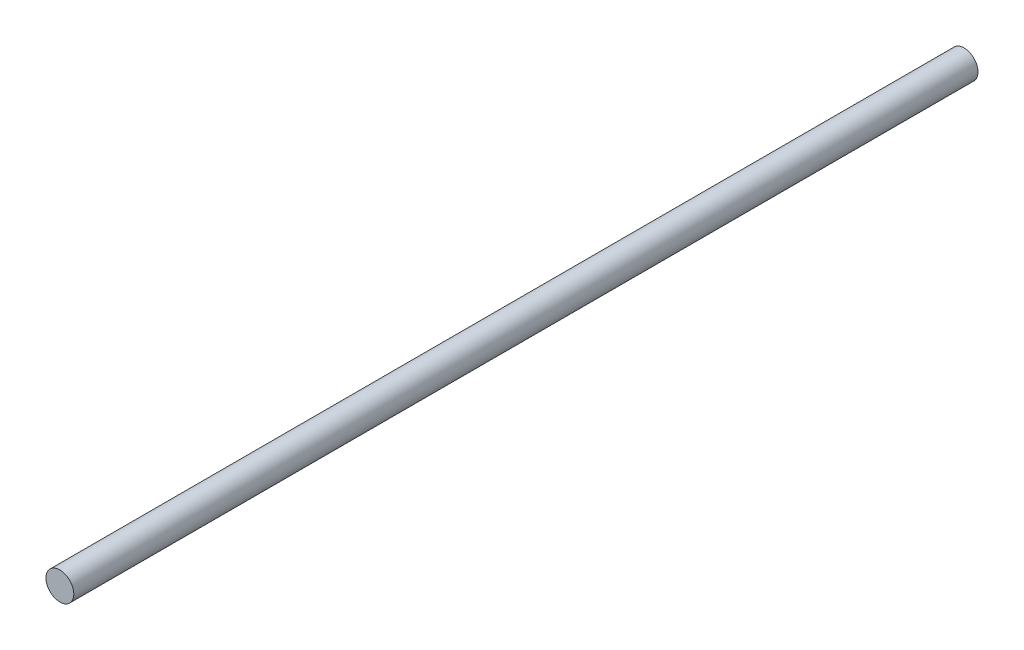
ISO-10303-21;
HEADER;
FILE_DESCRIPTION(('STEP AP214'),'2;1');
FILE_NAME('part.step','',(''),(''),'','','');
FILE_SCHEMA(('AUTOMOTIVE_DESIGN { 1 0 10303 214 1 1 1 1 }'));
ENDSEC;
DATA;
#1=APPLICATION_CONTEXT('core data for automotive mechanical design processes');
#2=APPLICATION_PROTOCOL_DEFINITION('international standard','automotive_design',2000,#1);
#3=PRODUCT_CONTEXT('',#1,'mechanical');
#4=PRODUCT('Part','Part','',(#3));
#5=PRODUCT_RELATED_PRODUCT_CATEGORY('part','',(#4));
#6=PRODUCT_DEFINITION_FORMATION('','',#4);
#7=PRODUCT_DEFINITION_CONTEXT('part definition',#1,'design');
#8=PRODUCT_DEFINITION('design','',#6,#7);
#9=PRODUCT_DEFINITION_SHAPE('','',#8);
#10=(LENGTH_UNIT() NAMED_UNIT(*) SI_UNIT(.MILLI.,.METRE.));
#11=(NAMED_UNIT(*) PLANE_ANGLE_UNIT() SI_UNIT($,.RADIAN.));
#12=(NAMED_UNIT(*) SI_UNIT($,.STERADIAN.) SOLID_ANGLE_UNIT());
#13=UNCERTAINTY_MEASURE_WITH_UNIT(LENGTH_MEASURE(1.E-05),#10,'distance_accuracy_value','');
#14=(GEOMETRIC_REPRESENTATION_CONTEXT(3) GLOBAL_UNCERTAINTY_ASSIGNED_CONTEXT((#13)) GLOBAL_UNIT_ASSIGNED_CONTEXT((#10,
#11,#12)) REPRESENTATION_CONTEXT('',''));
#15=CARTESIAN_POINT('',(0.,0.,0.));
#16=DIRECTION('',(0.,0.,1.));
#17=DIRECTION('',(1.,0.,0.));
#18=AXIS2_PLACEMENT_3D('',#15,#16,#17);
#19=CARTESIAN_POINT('',(0.,0.,130.));
#20=DIRECTION('',(0.,0.,-1.));
#21=DIRECTION('',(-1.,0.,0.));
#22=AXIS2_PLACEMENT_3D('',#19,#20,#21);
#23=CYLINDRICAL_SURFACE('',#22,2.);
#24=CARTESIAN_POINT('',(0.,0.,130.));
#25=DIRECTION('',(0.,0.,1.));
#26=DIRECTION('',(1.,0.,0.));
#27=AXIS2_PLACEMENT_3D('',#24,#25,#26);
#28=CIRCLE('',#27,2.);
#29=CARTESIAN_POINT('',(2.,0.,130.));
#30=VERTEX_POINT('',#29);
#31=EDGE_CURVE('E10',#30,#30,#28,.T.);
#32=ORIENTED_EDGE('',*,*,#31,.F.);
#33=EDGE_LOOP('',(#32));
#34=FACE_BOUND('',#33,.T.);
#35=CARTESIAN_POINT('',(0.,0.,0.));
#36=DIRECTION('',(0.,0.,1.));
#37=DIRECTION('',(1.,0.,0.));
#38=AXIS2_PLACEMENT_3D('',#35,#36,#37);
#39=CIRCLE('',#38,2.);
#40=CARTESIAN_POINT('',(2.,0.,0.));
#41=VERTEX_POINT('',#40);
#42=EDGE_CURVE('E34',#41,#41,#39,.T.);
#43=ORIENTED_EDGE('',*,*,#42,.T.);
#44=EDGE_LOOP('',(#43));
#45=FACE_BOUND('',#44,.T.);
#46=ADVANCED_FACE('F31',(#34,#45),#23,.T.);
#47=CARTESIAN_POINT('',(0.,0.,130.));
#48=DIRECTION('',(0.,0.,1.));
#49=DIRECTION('',(1.,0.,0.));
#50=AXIS2_PLACEMENT_3D('',#47,#48,#49);
#51=PLANE('',#50);
#52=ORIENTED_EDGE('',*,*,#31,.T.);
#53=EDGE_LOOP('',(#52));
#54=FACE_BOUND('',#53,.T.);
#55=ADVANCED_FACE('F46',(#54),#51,.T.);
#56=CARTESIAN_POINT('',(0.,0.,0.));
#57=DIRECTION('',(0.,0.,1.));
#58=DIRECTION('',(1.,0.,0.));
#59=AXIS2_PLACEMENT_3D('',#56,#57,#58);
#60=PLANE('',#59);
#61=ORIENTED_EDGE('',*,*,#42,.F.);
#62=EDGE_LOOP('',(#61));
#63=FACE_BOUND('',#62,.T.);
#64=ADVANCED_FACE('F44',(#63),#60,.F.);
#65=CLOSED_SHELL('',(#46,#55,#64));
#66=MANIFOLD_SOLID_BREP('B2',#65);
#67=ADVANCED_BREP_SHAPE_REPRESENTATION('',(#18,#66),#14);
#68=SHAPE_DEFINITION_REPRESENTATION(#9,#67);
ENDSEC;
END-ISO-10303-21;
